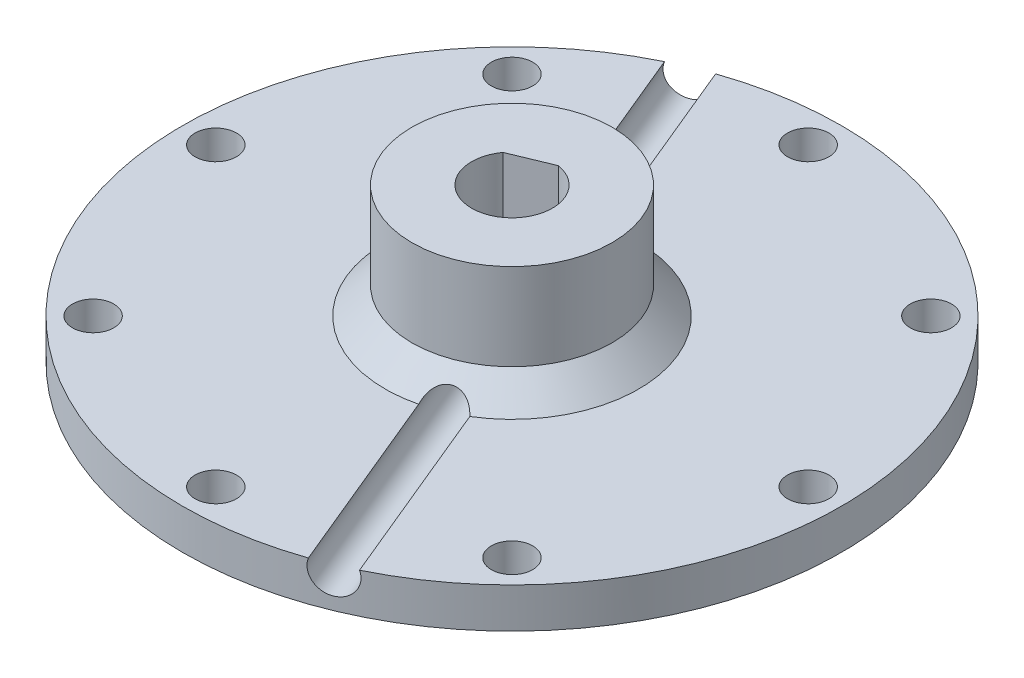
ISO-10303-21;
HEADER;
FILE_DESCRIPTION(('STEP AP214'),'2;1');
FILE_NAME('part.step','',(''),(''),'','','');
FILE_SCHEMA(('AUTOMOTIVE_DESIGN { 1 0 10303 214 1 1 1 1 }'));
ENDSEC;
DATA;
#1=APPLICATION_CONTEXT('core data for automotive mechanical design processes');
#2=APPLICATION_PROTOCOL_DEFINITION('international standard','automotive_design',2000,#1);
#3=PRODUCT_CONTEXT('',#1,'mechanical');
#4=PRODUCT('Part','Part','',(#3));
#5=PRODUCT_RELATED_PRODUCT_CATEGORY('part','',(#4));
#6=PRODUCT_DEFINITION_FORMATION('','',#4);
#7=PRODUCT_DEFINITION_CONTEXT('part definition',#1,'design');
#8=PRODUCT_DEFINITION('design','',#6,#7);
#9=PRODUCT_DEFINITION_SHAPE('','',#8);
#10=(LENGTH_UNIT() NAMED_UNIT(*) SI_UNIT(.MILLI.,.METRE.));
#11=(NAMED_UNIT(*) PLANE_ANGLE_UNIT() SI_UNIT($,.RADIAN.));
#12=(NAMED_UNIT(*) SI_UNIT($,.STERADIAN.) SOLID_ANGLE_UNIT());
#13=UNCERTAINTY_MEASURE_WITH_UNIT(LENGTH_MEASURE(1.E-05),#10,'distance_accuracy_value','');
#14=(GEOMETRIC_REPRESENTATION_CONTEXT(3) GLOBAL_UNCERTAINTY_ASSIGNED_CONTEXT((#13)) GLOBAL_UNIT_ASSIGNED_CONTEXT((#10,
#11,#12)) REPRESENTATION_CONTEXT('',''));
#15=CARTESIAN_POINT('',(0.,0.,0.));
#16=DIRECTION('',(0.,0.,1.));
#17=DIRECTION('',(1.,0.,0.));
#18=AXIS2_PLACEMENT_3D('',#15,#16,#17);
#19=CARTESIAN_POINT('',(0.,3.,0.));
#20=DIRECTION('',(0.,1.,0.));
#21=DIRECTION('',(0.,0.,1.));
#22=AXIS2_PLACEMENT_3D('',#19,#20,#21);
#23=PLANE('',#22);
#24=DIRECTION('',(0.38268343236509,0.,0.923879532511287));
#25=VECTOR('',#24,1.);
#26=CARTESIAN_POINT('',(-13.7035460192494,3.,-29.249464879421));
#27=LINE('',#26,#25);
#28=CARTESIAN_POINT('',(-10.7895840998216,3.,-22.2145384932994));
#29=VERTEX_POINT('',#28);
#30=CARTESIAN_POINT('',(-4.94733765736248,3.,-8.11010789718874));
#31=VERTEX_POINT('',#30);
#32=EDGE_CURVE('E69',#29,#31,#27,.T.);
#33=ORIENTED_EDGE('',*,*,#32,.F.);
#34=CARTESIAN_POINT('',(0.,3.,0.));
#35=DIRECTION('',(0.,1.,0.));
#36=DIRECTION('',(0.,0.,1.));
#37=AXIS2_PLACEMENT_3D('',#34,#35,#36);
#38=CIRCLE('',#37,24.6961706650526);
#39=CARTESIAN_POINT('',(8.07866272637523,3.,23.337438892708));
#40=VERTEX_POINT('',#39);
#41=EDGE_CURVE('E292',#29,#40,#38,.T.);
#42=ORIENTED_EDGE('',*,*,#41,.T.);
#43=CARTESIAN_POINT('',(2.23641628391495,2.99999999999957,9.23300829659804));
#44=VERTEX_POINT('',#43);
#45=EDGE_CURVE('E152',#44,#40,#27,.T.);
#46=ORIENTED_EDGE('',*,*,#45,.F.);
#47=CARTESIAN_POINT('',(0.,3.,0.));
#48=DIRECTION('',(0.,1.,0.));
#49=DIRECTION('',(0.,0.,1.));
#50=AXIS2_PLACEMENT_3D('',#47,#48,#49);
#51=CIRCLE('',#50,9.5);
#52=EDGE_CURVE('E115',#44,#31,#51,.F.);
#53=ORIENTED_EDGE('',*,*,#52,.T.);
#54=EDGE_LOOP('',(#33,#42,#46,#53));
#55=FACE_BOUND('',#54,.T.);
#56=CARTESIAN_POINT('',(-22.1961706650526,3.,0.));
#57=DIRECTION('',(0.,1.,0.));
#58=DIRECTION('',(0.,0.,1.));
#59=AXIS2_PLACEMENT_3D('',#56,#57,#58);
#60=CIRCLE('',#59,1.55);
#61=CARTESIAN_POINT('',(-22.1961706650526,3.,1.55));
#62=VERTEX_POINT('',#61);
#63=EDGE_CURVE('E289',#62,#62,#60,.T.);
#64=ORIENTED_EDGE('',*,*,#63,.F.);
#65=EDGE_LOOP('',(#64));
#66=FACE_BOUND('',#65,.T.);
#67=CARTESIAN_POINT('',(-15.6950627936326,3.,-15.6950627936326));
#68=DIRECTION('',(0.,1.,0.));
#69=DIRECTION('',(0.,0.,1.));
#70=AXIS2_PLACEMENT_3D('',#67,#68,#69);
#71=CIRCLE('',#70,1.55);
#72=CARTESIAN_POINT('',(-15.6950627936326,3.,-14.1450627936326));
#73=VERTEX_POINT('',#72);
#74=EDGE_CURVE('E286',#73,#73,#71,.T.);
#75=ORIENTED_EDGE('',*,*,#74,.F.);
#76=EDGE_LOOP('',(#75));
#77=FACE_BOUND('',#76,.T.);
#78=CARTESIAN_POINT('',(0.,3.,22.1961706650526));
#79=DIRECTION('',(0.,1.,0.));
#80=DIRECTION('',(0.,0.,1.));
#81=AXIS2_PLACEMENT_3D('',#78,#79,#80);
#82=CIRCLE('',#81,1.55);
#83=CARTESIAN_POINT('',(0.,3.,23.7461706650526));
#84=VERTEX_POINT('',#83);
#85=EDGE_CURVE('E271',#84,#84,#82,.T.);
#86=ORIENTED_EDGE('',*,*,#85,.F.);
#87=EDGE_LOOP('',(#86));
#88=FACE_BOUND('',#87,.T.);
#89=CARTESIAN_POINT('',(-15.6950627936326,3.,15.6950627936326));
#90=DIRECTION('',(0.,1.,0.));
#91=DIRECTION('',(0.,0.,1.));
#92=AXIS2_PLACEMENT_3D('',#89,#90,#91);
#93=CIRCLE('',#92,1.55);
#94=CARTESIAN_POINT('',(-15.6950627936326,3.,17.2450627936326));
#95=VERTEX_POINT('',#94);
#96=EDGE_CURVE('E269',#95,#95,#93,.T.);
#97=ORIENTED_EDGE('',*,*,#96,.F.);
#98=EDGE_LOOP('',(#97));
#99=FACE_BOUND('',#98,.T.);
#100=ADVANCED_FACE('F40',(#55,#66,#77,#88,#99),#23,.T.);
#101=CARTESIAN_POINT('',(-22.1961706650526,3.,0.));
#102=DIRECTION('',(0.,-1.,0.));
#103=DIRECTION('',(0.,0.,-1.));
#104=AXIS2_PLACEMENT_3D('',#101,#102,#103);
#105=CYLINDRICAL_SURFACE('',#104,1.55);
#106=ORIENTED_EDGE('',*,*,#63,.T.);
#107=EDGE_LOOP('',(#106));
#108=FACE_BOUND('',#107,.T.);
#109=CARTESIAN_POINT('',(-22.1961706650526,0.,0.));
#110=DIRECTION('',(0.,1.,0.));
#111=DIRECTION('',(0.,0.,1.));
#112=AXIS2_PLACEMENT_3D('',#109,#110,#111);
#113=CIRCLE('',#112,1.55);
#114=CARTESIAN_POINT('',(-22.1961706650526,0.,1.55));
#115=VERTEX_POINT('',#114);
#116=EDGE_CURVE('E244',#115,#115,#113,.T.);
#117=ORIENTED_EDGE('',*,*,#116,.F.);
#118=EDGE_LOOP('',(#117));
#119=FACE_BOUND('',#118,.T.);
#120=ADVANCED_FACE('F162',(#108,#119),#105,.F.);
#121=CARTESIAN_POINT('',(-15.6950627936326,3.,-15.6950627936326));
#122=DIRECTION('',(0.,-1.,0.));
#123=DIRECTION('',(0.,0.,-1.));
#124=AXIS2_PLACEMENT_3D('',#121,#122,#123);
#125=CYLINDRICAL_SURFACE('',#124,1.55);
#126=ORIENTED_EDGE('',*,*,#74,.T.);
#127=EDGE_LOOP('',(#126));
#128=FACE_BOUND('',#127,.T.);
#129=CARTESIAN_POINT('',(-15.6950627936326,0.,-15.6950627936326));
#130=DIRECTION('',(0.,1.,0.));
#131=DIRECTION('',(0.,0.,1.));
#132=AXIS2_PLACEMENT_3D('',#129,#130,#131);
#133=CIRCLE('',#132,1.55);
#134=CARTESIAN_POINT('',(-15.6950627936326,0.,-14.1450627936326));
#135=VERTEX_POINT('',#134);
#136=EDGE_CURVE('E240',#135,#135,#133,.T.);
#137=ORIENTED_EDGE('',*,*,#136,.F.);
#138=EDGE_LOOP('',(#137));
#139=FACE_BOUND('',#138,.T.);
#140=ADVANCED_FACE('F166',(#128,#139),#125,.F.);
#141=CARTESIAN_POINT('',(0.,3.,-22.1961706650526));
#142=DIRECTION('',(0.,-1.,0.));
#143=DIRECTION('',(0.,0.,-1.));
#144=AXIS2_PLACEMENT_3D('',#141,#142,#143);
#145=CYLINDRICAL_SURFACE('',#144,1.55);
#146=CARTESIAN_POINT('',(0.,3.,-22.1961706650526));
#147=DIRECTION('',(0.,1.,0.));
#148=DIRECTION('',(0.,0.,1.));
#149=AXIS2_PLACEMENT_3D('',#146,#147,#148);
#150=CIRCLE('',#149,1.55);
#151=CARTESIAN_POINT('',(0.,3.,-20.6461706650526));
#152=VERTEX_POINT('',#151);
#153=EDGE_CURVE('E283',#152,#152,#150,.T.);
#154=ORIENTED_EDGE('',*,*,#153,.T.);
#155=EDGE_LOOP('',(#154));
#156=FACE_BOUND('',#155,.T.);
#157=CARTESIAN_POINT('',(0.,0.,-22.1961706650526));
#158=DIRECTION('',(0.,1.,0.));
#159=DIRECTION('',(0.,0.,1.));
#160=AXIS2_PLACEMENT_3D('',#157,#158,#159);
#161=CIRCLE('',#160,1.55);
#162=CARTESIAN_POINT('',(0.,0.,-20.6461706650526));
#163=VERTEX_POINT('',#162);
#164=EDGE_CURVE('E236',#163,#163,#161,.T.);
#165=ORIENTED_EDGE('',*,*,#164,.F.);
#166=EDGE_LOOP('',(#165));
#167=FACE_BOUND('',#166,.T.);
#168=ADVANCED_FACE('F170',(#156,#167),#145,.F.);
#169=CARTESIAN_POINT('',(15.6950627936326,3.,-15.6950627936326));
#170=DIRECTION('',(0.,-1.,0.));
#171=DIRECTION('',(0.,0.,-1.));
#172=AXIS2_PLACEMENT_3D('',#169,#170,#171);
#173=CYLINDRICAL_SURFACE('',#172,1.55);
#174=CARTESIAN_POINT('',(15.6950627936326,3.,-15.6950627936326));
#175=DIRECTION('',(0.,1.,0.));
#176=DIRECTION('',(0.,0.,1.));
#177=AXIS2_PLACEMENT_3D('',#174,#175,#176);
#178=CIRCLE('',#177,1.55);
#179=CARTESIAN_POINT('',(15.6950627936326,3.,-14.1450627936326));
#180=VERTEX_POINT('',#179);
#181=EDGE_CURVE('E280',#180,#180,#178,.T.);
#182=ORIENTED_EDGE('',*,*,#181,.T.);
#183=EDGE_LOOP('',(#182));
#184=FACE_BOUND('',#183,.T.);
#185=CARTESIAN_POINT('',(15.6950627936326,0.,-15.6950627936326));
#186=DIRECTION('',(0.,1.,0.));
#187=DIRECTION('',(0.,0.,1.));
#188=AXIS2_PLACEMENT_3D('',#185,#186,#187);
#189=CIRCLE('',#188,1.55);
#190=CARTESIAN_POINT('',(15.6950627936326,0.,-14.1450627936326));
#191=VERTEX_POINT('',#190);
#192=EDGE_CURVE('E232',#191,#191,#189,.T.);
#193=ORIENTED_EDGE('',*,*,#192,.F.);
#194=EDGE_LOOP('',(#193));
#195=FACE_BOUND('',#194,.T.);
#196=ADVANCED_FACE('F174',(#184,#195),#173,.F.);
#197=CARTESIAN_POINT('',(22.1961706650526,3.,0.));
#198=DIRECTION('',(0.,-1.,0.));
#199=DIRECTION('',(0.,0.,-1.));
#200=AXIS2_PLACEMENT_3D('',#197,#198,#199);
#201=CYLINDRICAL_SURFACE('',#200,1.55);
#202=CARTESIAN_POINT('',(22.1961706650526,3.,0.));
#203=DIRECTION('',(0.,1.,0.));
#204=DIRECTION('',(0.,0.,1.));
#205=AXIS2_PLACEMENT_3D('',#202,#203,#204);
#206=CIRCLE('',#205,1.55);
#207=CARTESIAN_POINT('',(22.1961706650526,3.,1.55));
#208=VERTEX_POINT('',#207);
#209=EDGE_CURVE('E277',#208,#208,#206,.T.);
#210=ORIENTED_EDGE('',*,*,#209,.T.);
#211=EDGE_LOOP('',(#210));
#212=FACE_BOUND('',#211,.T.);
#213=CARTESIAN_POINT('',(22.1961706650526,0.,0.));
#214=DIRECTION('',(0.,1.,0.));
#215=DIRECTION('',(0.,0.,1.));
#216=AXIS2_PLACEMENT_3D('',#213,#214,#215);
#217=CIRCLE('',#216,1.55);
#218=CARTESIAN_POINT('',(22.1961706650526,0.,1.55));
#219=VERTEX_POINT('',#218);
#220=EDGE_CURVE('E228',#219,#219,#217,.T.);
#221=ORIENTED_EDGE('',*,*,#220,.F.);
#222=EDGE_LOOP('',(#221));
#223=FACE_BOUND('',#222,.T.);
#224=ADVANCED_FACE('F178',(#212,#223),#201,.F.);
#225=CARTESIAN_POINT('',(15.6950627936326,3.,15.6950627936326));
#226=DIRECTION('',(0.,-1.,0.));
#227=DIRECTION('',(0.,0.,-1.));
#228=AXIS2_PLACEMENT_3D('',#225,#226,#227);
#229=CYLINDRICAL_SURFACE('',#228,1.55);
#230=CARTESIAN_POINT('',(15.6950627936326,3.,15.6950627936326));
#231=DIRECTION('',(0.,1.,0.));
#232=DIRECTION('',(0.,0.,1.));
#233=AXIS2_PLACEMENT_3D('',#230,#231,#232);
#234=CIRCLE('',#233,1.55);
#235=CARTESIAN_POINT('',(15.6950627936326,3.,17.2450627936326));
#236=VERTEX_POINT('',#235);
#237=EDGE_CURVE('E274',#236,#236,#234,.T.);
#238=ORIENTED_EDGE('',*,*,#237,.T.);
#239=EDGE_LOOP('',(#238));
#240=FACE_BOUND('',#239,.T.);
#241=CARTESIAN_POINT('',(15.6950627936326,0.,15.6950627936326));
#242=DIRECTION('',(0.,1.,0.));
#243=DIRECTION('',(0.,0.,1.));
#244=AXIS2_PLACEMENT_3D('',#241,#242,#243);
#245=CIRCLE('',#244,1.55);
#246=CARTESIAN_POINT('',(15.6950627936326,0.,17.2450627936326));
#247=VERTEX_POINT('',#246);
#248=EDGE_CURVE('E224',#247,#247,#245,.T.);
#249=ORIENTED_EDGE('',*,*,#248,.F.);
#250=EDGE_LOOP('',(#249));
#251=FACE_BOUND('',#250,.T.);
#252=ADVANCED_FACE('F182',(#240,#251),#229,.F.);
#253=CARTESIAN_POINT('',(0.,3.,22.1961706650526));
#254=DIRECTION('',(0.,-1.,0.));
#255=DIRECTION('',(0.,0.,-1.));
#256=AXIS2_PLACEMENT_3D('',#253,#254,#255);
#257=CYLINDRICAL_SURFACE('',#256,1.55);
#258=ORIENTED_EDGE('',*,*,#85,.T.);
#259=EDGE_LOOP('',(#258));
#260=FACE_BOUND('',#259,.T.);
#261=CARTESIAN_POINT('',(0.,0.,22.1961706650526));
#262=DIRECTION('',(0.,1.,0.));
#263=DIRECTION('',(0.,0.,1.));
#264=AXIS2_PLACEMENT_3D('',#261,#262,#263);
#265=CIRCLE('',#264,1.55);
#266=CARTESIAN_POINT('',(0.,0.,23.7461706650526));
#267=VERTEX_POINT('',#266);
#268=EDGE_CURVE('E220',#267,#267,#265,.T.);
#269=ORIENTED_EDGE('',*,*,#268,.F.);
#270=EDGE_LOOP('',(#269));
#271=FACE_BOUND('',#270,.T.);
#272=ADVANCED_FACE('F186',(#260,#271),#257,.F.);
#273=CARTESIAN_POINT('',(-15.6950627936326,3.,15.6950627936326));
#274=DIRECTION('',(0.,-1.,0.));
#275=DIRECTION('',(0.,0.,-1.));
#276=AXIS2_PLACEMENT_3D('',#273,#274,#275);
#277=CYLINDRICAL_SURFACE('',#276,1.55);
#278=ORIENTED_EDGE('',*,*,#96,.T.);
#279=EDGE_LOOP('',(#278));
#280=FACE_BOUND('',#279,.T.);
#281=CARTESIAN_POINT('',(-15.6950627936326,0.,15.6950627936326));
#282=DIRECTION('',(0.,1.,0.));
#283=DIRECTION('',(0.,0.,1.));
#284=AXIS2_PLACEMENT_3D('',#281,#282,#283);
#285=CIRCLE('',#284,1.55);
#286=CARTESIAN_POINT('',(-15.6950627936326,0.,17.2450627936326));
#287=VERTEX_POINT('',#286);
#288=EDGE_CURVE('E216',#287,#287,#285,.T.);
#289=ORIENTED_EDGE('',*,*,#288,.F.);
#290=EDGE_LOOP('',(#289));
#291=FACE_BOUND('',#290,.T.);
#292=ADVANCED_FACE('F158',(#280,#291),#277,.F.);
#293=CARTESIAN_POINT('',(0.,3.,0.));
#294=DIRECTION('',(0.,-1.,0.));
#295=DIRECTION('',(0.,0.,-1.));
#296=AXIS2_PLACEMENT_3D('',#293,#294,#295);
#297=CYLINDRICAL_SURFACE('',#296,24.6961706650526);
#298=CARTESIAN_POINT('',(10.7895840998216,3.,22.2145384932994));
#299=VERTEX_POINT('',#298);
#300=CARTESIAN_POINT('',(-8.07866272637523,3.,-23.337438892708));
#301=VERTEX_POINT('',#300);
#302=EDGE_CURVE('E112',#299,#301,#38,.T.);
#303=ORIENTED_EDGE('',*,*,#302,.F.);
#304=CARTESIAN_POINT('',(10.7895840998216,3.,22.2145384932994));
#305=CARTESIAN_POINT('',(10.8022360928086,2.95879962781761,22.2083928428077));
#306=CARTESIAN_POINT('',(10.8133140382241,2.9170255524788,22.2029996113005));
#307=CARTESIAN_POINT('',(10.8322640657164,2.83259057458305,22.1937607504593));
#308=CARTESIAN_POINT('',(10.8401362861034,2.7899297103699,22.1899150543575));
#309=CARTESIAN_POINT('',(10.8588388864953,2.66114189934561,22.1807726157804));
#310=CARTESIAN_POINT('',(10.8647966432603,2.57407426730937,22.177850299482));
#311=CARTESIAN_POINT('',(10.8634984916603,2.40006320132649,22.1784860302414));
#312=CARTESIAN_POINT('',(10.856236153074,2.31311984841532,22.1820472308658));
#313=CARTESIAN_POINT('',(10.8286930993518,2.14183088982806,22.1955059414178));
#314=CARTESIAN_POINT('',(10.8084149380635,2.05748477794634,22.2054022083349));
#315=CARTESIAN_POINT('',(10.7553727091612,1.89376877390713,22.2311418109063));
#316=CARTESIAN_POINT('',(10.7226075821615,1.81439930463019,22.2469856511472));
#317=CARTESIAN_POINT('',(10.6454506229444,1.66286769418197,22.2840088427002));
#318=CARTESIAN_POINT('',(10.6010568581839,1.59070675373967,22.3051890808367));
#319=CARTESIAN_POINT('',(10.5017340006025,1.45552656179287,22.3521238703291));
#320=CARTESIAN_POINT('',(10.4467874488021,1.39252276803391,22.3778859968588));
#321=CARTESIAN_POINT('',(10.3278741180891,1.27758387700326,22.4330146731566));
#322=CARTESIAN_POINT('',(10.2639078700666,1.22564812872919,22.4623810107713));
#323=CARTESIAN_POINT('',(10.1286189431594,1.13427573766546,22.5237083083923));
#324=CARTESIAN_POINT('',(10.057290439116,1.09484909436228,22.5556713186127));
#325=CARTESIAN_POINT('',(9.90926799710084,1.02967692543697,22.6210918045258));
#326=CARTESIAN_POINT('',(9.83257399388917,1.00393156620036,22.6545492983885));
#327=CARTESIAN_POINT('',(9.67606085720705,0.966887981824472,22.7218382654112));
#328=CARTESIAN_POINT('',(9.59624616541288,0.955569942177125,22.7556691611468));
#329=CARTESIAN_POINT('',(9.43564166056505,0.947641643328105,22.8227317306031));
#330=CARTESIAN_POINT('',(9.35485186378584,0.951031138996082,22.8559634143017));
#331=CARTESIAN_POINT('',(9.19471384650946,0.972404857861036,22.9208537974291));
#332=CARTESIAN_POINT('',(9.1153637992393,0.990369038646257,22.9525145936618));
#333=CARTESIAN_POINT('',(8.9602752418756,1.04035192806661,23.0135017154118));
#334=CARTESIAN_POINT('',(8.8845367631239,1.07237075864591,23.0428280206714));
#335=CARTESIAN_POINT('',(8.73881687301453,1.14957984680581,23.0984852322));
#336=CARTESIAN_POINT('',(8.66883984497706,1.19478001617149,23.1248138635593));
#337=CARTESIAN_POINT('',(8.53675771208966,1.29706140064328,23.1738988051234));
#338=CARTESIAN_POINT('',(8.47465273500001,1.35414280853749,23.1966550573514));
#339=CARTESIAN_POINT('',(8.36005331339816,1.47868445638766,23.2382031245833));
#340=CARTESIAN_POINT('',(8.30757578764602,1.54616259139837,23.2569879691112));
#341=CARTESIAN_POINT('',(8.21394309931337,1.68951370987362,23.2902224279577));
#342=CARTESIAN_POINT('',(8.17278725043664,1.76538618409989,23.3046723050576));
#343=CARTESIAN_POINT('',(8.10304780692007,1.92336894897091,23.3290126796536));
#344=CARTESIAN_POINT('',(8.07446234942336,2.00547831322938,23.3389038527327));
#345=CARTESIAN_POINT('',(8.03072635730518,2.17364910770879,23.3539893837585));
#346=CARTESIAN_POINT('',(8.01558048696062,2.25971189909631,23.359182111098));
#347=CARTESIAN_POINT('',(7.99921207685348,2.43319576767113,23.3647924758908));
#348=CARTESIAN_POINT('',(7.99797482047534,2.52061531115866,23.3652151604977));
#349=CARTESIAN_POINT('',(8.00943754926358,2.69434563507746,23.3612883614247));
#350=CARTESIAN_POINT('',(8.02211404236827,2.78065803623228,23.3569469215251));
#351=CARTESIAN_POINT('',(8.04673153782703,2.88790204757831,23.3484685370391));
#352=CARTESIAN_POINT('',(8.05245053209231,2.91055342740217,23.3464971112647));
#353=CARTESIAN_POINT('',(8.0648434113593,2.95552370214161,23.3422190630859));
#354=CARTESIAN_POINT('',(8.07151581685066,2.9778430541249,23.339912959951));
#355=CARTESIAN_POINT('',(8.07866272637523,3.,23.337438892708));
#356=B_SPLINE_CURVE_WITH_KNOTS('',3,(#304,#305,#306,#307,#308,#309,#310,#311,#312,#313,#314,
#315,#316,#317,#318,#319,#320,#321,#322,#323,#324,#325,#326,#327,#328,#329,#330,#331,#332,#333,
#334,#335,#336,#337,#338,#339,#340,#341,#342,#343,#344,#345,#346,#347,#348,#349,#350,#351,#352,
#353,#354,#355),.UNSPECIFIED.,.F.,.F.,(4,2,2,2,2,2,2,2,2,2,2,2,2,2,2,2,2,2,2,2,2,2,2,2,2,4),(0.,
0.130525574978584,0.261045517865425,0.521661569811764,0.782404418630193,1.04309612247034,
1.30380994814602,1.56456712891937,1.82575949280557,2.08693648958715,2.34832174219255,
2.60971017357332,2.87073922543377,3.13176392674224,3.39243028651257,3.65309890798057,
3.91396404840913,4.17483342203377,4.43615693147836,4.69746459654972,4.95873352432607,
5.22009309138493,5.48117608949417,5.74181895058583,5.81213954096621,5.88235216915003),.UNSPECIFIED.);
#357=EDGE_CURVE('E144',#299,#40,#356,.T.);
#358=ORIENTED_EDGE('',*,*,#357,.T.);
#359=ORIENTED_EDGE('',*,*,#41,.F.);
#360=CARTESIAN_POINT('',(-10.7895840998216,3.,-22.2145384932994));
#361=CARTESIAN_POINT('',(-10.8022360928086,2.95879962781761,-22.2083928428077));
#362=CARTESIAN_POINT('',(-10.8133140382241,2.9170255524788,-22.2029996113005));
#363=CARTESIAN_POINT('',(-10.8322640657164,2.83259057458306,-22.1937607504593));
#364=CARTESIAN_POINT('',(-10.8401362861034,2.78992971036991,-22.1899150543575));
#365=CARTESIAN_POINT('',(-10.8588388864953,2.66114189934561,-22.1807726157804));
#366=CARTESIAN_POINT('',(-10.8647966432603,2.57407426730937,-22.177850299482));
#367=CARTESIAN_POINT('',(-10.8634984916604,2.40006320132649,-22.1784860302414));
#368=CARTESIAN_POINT('',(-10.856236153074,2.31311984841532,-22.1820472308658));
#369=CARTESIAN_POINT('',(-10.8286930993518,2.14183088982806,-22.1955059414178));
#370=CARTESIAN_POINT('',(-10.8084149380635,2.05748477794634,-22.2054022083349));
#371=CARTESIAN_POINT('',(-10.7553727091612,1.89376877390713,-22.2311418109063));
#372=CARTESIAN_POINT('',(-10.7226075821615,1.81439930463019,-22.2469856511472));
#373=CARTESIAN_POINT('',(-10.6454506229444,1.66286769418198,-22.2840088427002));
#374=CARTESIAN_POINT('',(-10.6010568581839,1.59070675373967,-22.3051890808367));
#375=CARTESIAN_POINT('',(-10.5017340006025,1.45552656179288,-22.3521238703291));
#376=CARTESIAN_POINT('',(-10.4467874488021,1.39252276803391,-22.3778859968588));
#377=CARTESIAN_POINT('',(-10.3278741180891,1.27758387700327,-22.4330146731566));
#378=CARTESIAN_POINT('',(-10.2639078700666,1.22564812872919,-22.4623810107713));
#379=CARTESIAN_POINT('',(-10.1286189431594,1.13427573766546,-22.5237083083923));
#380=CARTESIAN_POINT('',(-10.057290439116,1.09484909436228,-22.5556713186127));
#381=CARTESIAN_POINT('',(-9.90926799710085,1.02967692543697,-22.6210918045258));
#382=CARTESIAN_POINT('',(-9.83257399388917,1.00393156620036,-22.6545492983885));
#383=CARTESIAN_POINT('',(-9.67606085720705,0.966887981824473,-22.7218382654112));
#384=CARTESIAN_POINT('',(-9.59624616541288,0.955569942177125,-22.7556691611468));
#385=CARTESIAN_POINT('',(-9.43564166056505,0.947641643328105,-22.8227317306031));
#386=CARTESIAN_POINT('',(-9.35485186378584,0.951031138996082,-22.8559634143017));
#387=CARTESIAN_POINT('',(-9.19471384650947,0.972404857861035,-22.9208537974291));
#388=CARTESIAN_POINT('',(-9.1153637992393,0.990369038646256,-22.9525145936618));
#389=CARTESIAN_POINT('',(-8.9602752418756,1.04035192806661,-23.0135017154118));
#390=CARTESIAN_POINT('',(-8.88453676312391,1.07237075864591,-23.0428280206714));
#391=CARTESIAN_POINT('',(-8.73881687301454,1.14957984680581,-23.0984852322));
#392=CARTESIAN_POINT('',(-8.66883984497707,1.19478001617149,-23.1248138635593));
#393=CARTESIAN_POINT('',(-8.53675771208967,1.29706140064328,-23.1738988051234));
#394=CARTESIAN_POINT('',(-8.47465273500001,1.35414280853748,-23.1966550573514));
#395=CARTESIAN_POINT('',(-8.36005331339816,1.47868445638766,-23.2382031245833));
#396=CARTESIAN_POINT('',(-8.30757578764603,1.54616259139836,-23.2569879691112));
#397=CARTESIAN_POINT('',(-8.21394309931337,1.68951370987362,-23.2902224279577));
#398=CARTESIAN_POINT('',(-8.17278725043665,1.76538618409988,-23.3046723050576));
#399=CARTESIAN_POINT('',(-8.10304780692008,1.92336894897091,-23.3290126796536));
#400=CARTESIAN_POINT('',(-8.07446234942336,2.00547831322937,-23.3389038527327));
#401=CARTESIAN_POINT('',(-8.03072635730518,2.17364910770878,-23.3539893837585));
#402=CARTESIAN_POINT('',(-8.01558048696062,2.2597118990963,-23.359182111098));
#403=CARTESIAN_POINT('',(-7.99921207685348,2.43319576767112,-23.3647924758908));
#404=CARTESIAN_POINT('',(-7.99797482047534,2.52061531115865,-23.3652151604977));
#405=CARTESIAN_POINT('',(-8.00943754926358,2.69434563507745,-23.3612883614247));
#406=CARTESIAN_POINT('',(-8.02211404236827,2.78065803623228,-23.3569469215251));
#407=CARTESIAN_POINT('',(-8.04673153782703,2.88790204757831,-23.3484685370391));
#408=CARTESIAN_POINT('',(-8.05245053209231,2.91055342740217,-23.3464971112647));
#409=CARTESIAN_POINT('',(-8.0648434113593,2.95552370214161,-23.3422190630859));
#410=CARTESIAN_POINT('',(-8.07151581685066,2.9778430541249,-23.339912959951));
#411=CARTESIAN_POINT('',(-8.07866272637523,3.,-23.337438892708));
#412=B_SPLINE_CURVE_WITH_KNOTS('',3,(#360,#361,#362,#363,#364,#365,#366,#367,#368,#369,#370,
#371,#372,#373,#374,#375,#376,#377,#378,#379,#380,#381,#382,#383,#384,#385,#386,#387,#388,#389,
#390,#391,#392,#393,#394,#395,#396,#397,#398,#399,#400,#401,#402,#403,#404,#405,#406,#407,#408,
#409,#410,#411),.UNSPECIFIED.,.F.,.F.,(4,2,2,2,2,2,2,2,2,2,2,2,2,2,2,2,2,2,2,2,2,2,2,2,2,4),(0.,
0.130525574978583,0.261045517865424,0.52166156981176,0.782404418630188,1.04309612247034,
1.30380994814602,1.56456712891936,1.82575949280556,2.08693648958714,2.34832174219254,
2.60971017357331,2.87073922543377,3.13176392674224,3.39243028651256,3.65309890798057,
3.91396404840912,4.17483342203376,4.43615693147835,4.69746459654972,4.95873352432606,
5.22009309138492,5.48117608949417,5.74181895058583,5.81213954096621,5.88235216915003),.UNSPECIFIED.);
#413=EDGE_CURVE('E136',#29,#301,#412,.T.);
#414=ORIENTED_EDGE('',*,*,#413,.T.);
#415=EDGE_LOOP('',(#303,#358,#359,#414));
#416=FACE_BOUND('',#415,.T.);
#417=CARTESIAN_POINT('',(0.,0.,0.));
#418=DIRECTION('',(0.,1.,0.));
#419=DIRECTION('',(0.,0.,1.));
#420=AXIS2_PLACEMENT_3D('',#417,#418,#419);
#421=CIRCLE('',#420,24.6961706650526);
#422=CARTESIAN_POINT('',(0.,0.,24.6961706650526));
#423=VERTEX_POINT('',#422);
#424=EDGE_CURVE('E248',#423,#423,#421,.T.);
#425=ORIENTED_EDGE('',*,*,#424,.T.);
#426=EDGE_LOOP('',(#425));
#427=FACE_BOUND('',#426,.T.);
#428=ADVANCED_FACE('F153',(#416,#427),#297,.T.);
#429=DIRECTION('',(0.38268343236509,0.,0.923879532511287));
#430=VECTOR('',#429,1.);
#431=CARTESIAN_POINT('',(-10.9926246458031,3.,-30.3723652788295));
#432=LINE('',#431,#430);
#433=CARTESIAN_POINT('',(4.94733765736248,3.,8.11010789718874));
#434=VERTEX_POINT('',#433);
#435=EDGE_CURVE('E62',#299,#434,#432,.F.);
#436=ORIENTED_EDGE('',*,*,#435,.F.);
#437=ORIENTED_EDGE('',*,*,#302,.T.);
#438=CARTESIAN_POINT('',(-2.23641628391495,2.99999999999957,-9.23300829659804));
#439=VERTEX_POINT('',#438);
#440=EDGE_CURVE('E99',#439,#301,#432,.F.);
#441=ORIENTED_EDGE('',*,*,#440,.F.);
#442=EDGE_CURVE('E105',#439,#434,#51,.F.);
#443=ORIENTED_EDGE('',*,*,#442,.T.);
#444=EDGE_LOOP('',(#436,#437,#441,#443));
#445=FACE_BOUND('',#444,.T.);
#446=ORIENTED_EDGE('',*,*,#237,.F.);
#447=EDGE_LOOP('',(#446));
#448=FACE_BOUND('',#447,.T.);
#449=ORIENTED_EDGE('',*,*,#209,.F.);
#450=EDGE_LOOP('',(#449));
#451=FACE_BOUND('',#450,.T.);
#452=ORIENTED_EDGE('',*,*,#181,.F.);
#453=EDGE_LOOP('',(#452));
#454=FACE_BOUND('',#453,.T.);
#455=ORIENTED_EDGE('',*,*,#153,.F.);
#456=EDGE_LOOP('',(#455));
#457=FACE_BOUND('',#456,.T.);
#458=ADVANCED_FACE('F109',(#445,#448,#451,#454,#457),#23,.T.);
#459=CARTESIAN_POINT('',(0.,0.,0.));
#460=DIRECTION('',(0.,1.,0.));
#461=DIRECTION('',(0.,0.,1.));
#462=AXIS2_PLACEMENT_3D('',#459,#460,#461);
#463=PLANE('',#462);
#464=ORIENTED_EDGE('',*,*,#288,.T.);
#465=EDGE_LOOP('',(#464));
#466=FACE_BOUND('',#465,.T.);
#467=ORIENTED_EDGE('',*,*,#268,.T.);
#468=EDGE_LOOP('',(#467));
#469=FACE_BOUND('',#468,.T.);
#470=ORIENTED_EDGE('',*,*,#248,.T.);
#471=EDGE_LOOP('',(#470));
#472=FACE_BOUND('',#471,.T.);
#473=ORIENTED_EDGE('',*,*,#220,.T.);
#474=EDGE_LOOP('',(#473));
#475=FACE_BOUND('',#474,.T.);
#476=ORIENTED_EDGE('',*,*,#192,.T.);
#477=EDGE_LOOP('',(#476));
#478=FACE_BOUND('',#477,.T.);
#479=ORIENTED_EDGE('',*,*,#164,.T.);
#480=EDGE_LOOP('',(#479));
#481=FACE_BOUND('',#480,.T.);
#482=ORIENTED_EDGE('',*,*,#136,.T.);
#483=EDGE_LOOP('',(#482));
#484=FACE_BOUND('',#483,.T.);
#485=ORIENTED_EDGE('',*,*,#116,.T.);
#486=EDGE_LOOP('',(#485));
#487=FACE_BOUND('',#486,.T.);
#488=ORIENTED_EDGE('',*,*,#424,.F.);
#489=EDGE_LOOP('',(#488));
#490=FACE_BOUND('',#489,.T.);
#491=CARTESIAN_POINT('',(0.,0.,0.));
#492=DIRECTION('',(0.,1.,0.));
#493=DIRECTION('',(0.,0.,1.));
#494=AXIS2_PLACEMENT_3D('',#491,#492,#493);
#495=CIRCLE('',#494,3.025);
#496=CARTESIAN_POINT('',(-2.45202312898459,0.,-1.77149868047498));
#497=VERTEX_POINT('',#496);
#498=CARTESIAN_POINT('',(0.481203452304365,0.,-2.98648091195814));
#499=VERTEX_POINT('',#498);
#500=EDGE_CURVE('E252',#497,#499,#495,.T.);
#501=ORIENTED_EDGE('',*,*,#500,.T.);
#502=DIRECTION('',(0.923879532511287,0.,-0.38268343236509));
#503=VECTOR('',#502,1.);
#504=CARTESIAN_POINT('',(-0.985409838340105,0.,-2.37898979621656));
#505=LINE('',#504,#503);
#506=EDGE_CURVE('E254',#497,#499,#505,.T.);
#507=ORIENTED_EDGE('',*,*,#506,.F.);
#508=EDGE_LOOP('',(#501,#507));
#509=FACE_BOUND('',#508,.T.);
#510=ADVANCED_FACE('F160',(#466,#469,#472,#475,#478,#481,#484,#487,#490,#509),#463,.F.);
#511=CARTESIAN_POINT('',(0.,11.5,0.));
#512=DIRECTION('',(0.,-1.,0.));
#513=DIRECTION('',(0.,0.,-1.));
#514=AXIS2_PLACEMENT_3D('',#511,#512,#513);
#515=CYLINDRICAL_SURFACE('',#514,3.025);
#516=CARTESIAN_POINT('',(2.42611589891925,2.5,1.80681671594307));
#517=CARTESIAN_POINT('',(2.42611335969098,2.41954877668076,1.80682591563397));
#518=CARTESIAN_POINT('',(2.42174223432623,2.33900315854965,1.81273576978432));
#519=CARTESIAN_POINT('',(2.40435168186248,2.18040971369051,1.83573205341519));
#520=CARTESIAN_POINT('',(2.39131499047382,2.10236719988277,1.85284079324418));
#521=CARTESIAN_POINT('',(2.35693645354836,1.9513768327537,1.89637356902245));
#522=CARTESIAN_POINT('',(2.33564049627968,1.87840341210594,1.92274606077229));
#523=CARTESIAN_POINT('',(2.28498255467964,1.73850609549052,1.98267871027372));
#524=CARTESIAN_POINT('',(2.2556197960782,1.67158278104584,2.01623955791202));
#525=CARTESIAN_POINT('',(2.18606742374154,1.53927179770308,2.0915496367093));
#526=CARTESIAN_POINT('',(2.14515889309192,1.474522493648,2.13375691734257));
#527=CARTESIAN_POINT('',(2.05407702625416,1.35449025415653,2.2215751821185));
#528=CARTESIAN_POINT('',(2.00389889346798,1.29921224836196,2.26718792111669));
#529=CARTESIAN_POINT('',(1.89055491281362,1.1958081781109,2.36268838717468));
#530=CARTESIAN_POINT('',(1.82671597862932,1.14847863684465,2.4126482082651));
#531=CARTESIAN_POINT('',(1.6894134214709,1.06792287397047,2.51069761220414));
#532=CARTESIAN_POINT('',(1.61595621442744,1.03468731297695,2.55878841430482));
#533=CARTESIAN_POINT('',(1.46682339325955,0.985828932648054,2.6468829319053));
#534=CARTESIAN_POINT('',(1.39171557717191,0.969083427178568,2.68722184852151));
#535=CARTESIAN_POINT('',(1.23685697641882,0.949971752980353,2.76191628079421));
#536=CARTESIAN_POINT('',(1.15710919779662,0.947596376885469,2.79627561403471));
#537=CARTESIAN_POINT('',(1.00312911067712,0.956885479738964,2.85491269532514));
#538=CARTESIAN_POINT('',(0.929057242409425,0.967289049344221,2.87982416717148));
#539=CARTESIAN_POINT('',(0.781568287990435,0.999568261486031,2.92330087847112));
#540=CARTESIAN_POINT('',(0.708151251490788,1.02144476654564,2.9418656406122));
#541=CARTESIAN_POINT('',(0.563078699820142,1.07616049940242,2.97307100536979));
#542=CARTESIAN_POINT('',(0.491459386649373,1.10914106572549,2.98562990108788));
#543=CARTESIAN_POINT('',(0.352813228794187,1.18491752565744,3.00517169437008));
#544=CARTESIAN_POINT('',(0.28578800767399,1.22771686625516,3.01215262986243));
#545=CARTESIAN_POINT('',(0.151615552044704,1.32672203549003,3.02201818152414));
#546=CARTESIAN_POINT('',(0.0850994473980979,1.38383041471826,3.0244345751437));
#547=CARTESIAN_POINT('',(-0.0386720986651586,1.50743205176079,3.02538728354007));
#548=CARTESIAN_POINT('',(-0.0959197895490483,1.57393307788253,3.02392036857738));
#549=CARTESIAN_POINT('',(-0.202740962632213,1.72003786883287,3.01870445390612));
#550=CARTESIAN_POINT('',(-0.25151017791939,1.80022966171224,3.01480468204696));
#551=CARTESIAN_POINT('',(-0.333493320403339,1.96819408797235,3.00684549619263));
#552=CARTESIAN_POINT('',(-0.366724088504396,2.05595839128204,3.00278626022672));
#553=CARTESIAN_POINT('',(-0.413189514262967,2.22919416262904,2.9967334856893));
#554=CARTESIAN_POINT('',(-0.427815609480395,2.31428381318527,2.99460024353686));
#555=CARTESIAN_POINT('',(-0.440564575261205,2.48569218929386,2.99275441769474));
#556=CARTESIAN_POINT('',(-0.438700533293264,2.57200988588584,2.99303991435494));
#557=CARTESIAN_POINT('',(-0.419867685043623,2.73257174561473,2.99573011688823));
#558=CARTESIAN_POINT('',(-0.4047022102714,2.80704135052952,2.99788148211388));
#559=CARTESIAN_POINT('',(-0.362672898015103,2.95255360296987,3.00325469737486));
#560=CARTESIAN_POINT('',(-0.335805014187873,3.02359505569667,3.00647691758842));
#561=CARTESIAN_POINT('',(-0.270256322570867,3.16395957977124,3.0130904458659));
#562=CARTESIAN_POINT('',(-0.231090152556572,3.2330543229061,3.01648272978165));
#563=CARTESIAN_POINT('',(-0.143053389237048,3.36481418964628,3.02193731270739));
#564=CARTESIAN_POINT('',(-0.0941777978127882,3.42747597645472,3.023998924395));
#565=CARTESIAN_POINT('',(0.0188885901865116,3.55336082041319,3.0255366191547));
#566=CARTESIAN_POINT('',(0.0842533291681622,3.61553890920874,3.02463018610618));
#567=CARTESIAN_POINT('',(0.223521812025064,3.72917064825512,3.0175361859016));
#568=CARTESIAN_POINT('',(0.297428895816652,3.78062008158178,3.01134654701878));
#569=CARTESIAN_POINT('',(0.454074883410826,3.87275170816148,2.99179825501848));
#570=CARTESIAN_POINT('',(0.537019097093992,3.9130421969544,2.97821920100737));
#571=CARTESIAN_POINT('',(0.706826869104419,3.97887400741653,2.9425364315885));
#572=CARTESIAN_POINT('',(0.793686740128718,4.0044289049462,2.92044059409122));
#573=CARTESIAN_POINT('',(0.959708988095148,4.03776183938971,2.86991138691474));
#574=CARTESIAN_POINT('',(1.03882258080197,4.0469923452584,2.84227485857842));
#575=CARTESIAN_POINT('',(1.1947961403514,4.05175624070664,2.78030883725933));
#576=CARTESIAN_POINT('',(1.27165696886393,4.04729493821437,2.74598194277494));
#577=CARTESIAN_POINT('',(1.41531890152986,4.02573428841801,2.67459862880595));
#578=CARTESIAN_POINT('',(1.48244646940406,4.00955956382106,2.63791182023711));
#579=CARTESIAN_POINT('',(1.61112417563626,3.96631926239284,2.56134972976354));
#580=CARTESIAN_POINT('',(1.67267354955375,3.93925219562231,2.52147401225323));
#581=CARTESIAN_POINT('',(1.79159472859978,3.87385852208841,2.43850120560746));
#582=CARTESIAN_POINT('',(1.8486900316641,3.8351140550023,2.39533908197524));
#583=CARTESIAN_POINT('',(1.95517371791695,3.7479833464837,2.30924597760345));
#584=CARTESIAN_POINT('',(2.00455859138012,3.69959273689051,2.26631511066487));
#585=CARTESIAN_POINT('',(2.10008008486776,3.58873899717953,2.17828633445753));
#586=CARTESIAN_POINT('',(2.1453481930529,3.52533674540387,2.13342566696064));
#587=CARTESIAN_POINT('',(2.22607016315682,3.38926279729588,2.04906181895448));
#588=CARTESIAN_POINT('',(2.26151457968987,3.3165822773679,2.00956381307466));
#589=CARTESIAN_POINT('',(2.32357609890138,3.16029840337218,1.93751702897676));
#590=CARTESIAN_POINT('',(2.34978970653947,3.07637721385238,1.90530395113836));
#591=CARTESIAN_POINT('',(2.39094448515739,2.90227426944397,1.85341113932439));
#592=CARTESIAN_POINT('',(2.40592317734874,2.81211446167861,1.83368972162661));
#593=CARTESIAN_POINT('',(2.41878544765035,2.68407817341475,1.8166256493584));
#594=CARTESIAN_POINT('',(2.42153162226871,2.64742073269914,1.81295857125678));
#595=CARTESIAN_POINT('',(2.42519749062123,2.57384883744826,1.80805191326021));
#596=CARTESIAN_POINT('',(2.426117064654,2.53693436622824,1.80681249245536));
#597=CARTESIAN_POINT('',(2.42611589891925,2.5,1.80681671594307));
#598=B_SPLINE_CURVE_WITH_KNOTS('',3,(#516,#517,#518,#519,#520,#521,#522,#523,#524,#525,#526,
#527,#528,#529,#530,#531,#532,#533,#534,#535,#536,#537,#538,#539,#540,#541,#542,#543,#544,#545,
#546,#547,#548,#549,#550,#551,#552,#553,#554,#555,#556,#557,#558,#559,#560,#561,#562,#563,#564,
#565,#566,#567,#568,#569,#570,#571,#572,#573,#574,#575,#576,#577,#578,#579,#580,#581,#582,#583,
#584,#585,#586,#587,#588,#589,#590,#591,#592,#593,#594,#595,#596,#597),.UNSPECIFIED.,.T.,.F.,(4,
2,2,2,2,2,2,2,2,2,2,2,2,2,2,2,2,2,2,2,2,2,2,2,2,2,2,2,2,2,2,2,2,2,2,2,2,2,2,2,4),(0.,
0.24119803969301,0.482878061043634,0.723234118546388,0.963613254039653,1.22487290915804,
1.48626813489677,1.76639761131735,2.04634116857977,2.30553931672435,2.56457137135833,
2.79997529335275,3.03539691530047,3.27393613114082,3.51255921729428,3.77455593973962,
4.03677063274789,4.31711499629018,4.59715480823461,4.85470694808801,5.11205469892157,
5.33911795673492,5.5662597886388,5.80382146581764,6.04150575099799,6.31096677425809,
6.58053351102395,6.85862017816281,7.13645023376989,7.38800888272922,7.63947002181133,
7.87298587557807,8.10653368232241,8.3497013824994,8.59297944995619,8.86149624111446,
9.13027031996825,9.40964973917606,9.68809190973148,9.79881630430286,9.90954795466206),.UNSPECIFIED.);
#599=CARTESIAN_POINT('',(2.42611589891925,2.5,1.80681671594307));
#600=VERTEX_POINT('',#599);
#601=EDGE_CURVE('E256',#600,#600,#598,.T.);
#602=ORIENTED_EDGE('',*,*,#601,.F.);
#603=EDGE_LOOP('',(#602));
#604=FACE_BOUND('',#603,.T.);
#605=ORIENTED_EDGE('',*,*,#500,.F.);
#606=DIRECTION('',(0.,-1.,0.));
#607=VECTOR('',#606,1.);
#608=CARTESIAN_POINT('',(-2.45202312898459,11.5,-1.77149868047498));
#609=LINE('',#608,#607);
#610=CARTESIAN_POINT('',(-2.45202312898459,11.5,-1.77149868047498));
#611=VERTEX_POINT('',#610);
#612=EDGE_CURVE('E267',#611,#497,#609,.T.);
#613=ORIENTED_EDGE('',*,*,#612,.F.);
#614=CARTESIAN_POINT('',(0.,11.5,0.));
#615=DIRECTION('',(0.,1.,0.));
#616=DIRECTION('',(0.,0.,1.));
#617=AXIS2_PLACEMENT_3D('',#614,#615,#616);
#618=CIRCLE('',#617,3.025);
#619=CARTESIAN_POINT('',(0.481203452304365,11.5,-2.98648091195814));
#620=VERTEX_POINT('',#619);
#621=EDGE_CURVE('E258',#611,#620,#618,.T.);
#622=ORIENTED_EDGE('',*,*,#621,.T.);
#623=DIRECTION('',(0.,-1.,0.));
#624=VECTOR('',#623,1.);
#625=CARTESIAN_POINT('',(0.481203452304365,11.5,-2.98648091195814));
#626=LINE('',#625,#624);
#627=EDGE_CURVE('E265',#620,#499,#626,.T.);
#628=ORIENTED_EDGE('',*,*,#627,.T.);
#629=EDGE_LOOP('',(#605,#613,#622,#628));
#630=FACE_BOUND('',#629,.T.);
#631=ADVANCED_FACE('F206',(#604,#630),#515,.F.);
#632=CARTESIAN_POINT('',(-0.985409838340105,11.5,-2.37898979621656));
#633=DIRECTION('',(-0.38268343236509,0.,-0.923879532511287));
#634=DIRECTION('',(-0.923879532511287,0.,0.38268343236509));
#635=AXIS2_PLACEMENT_3D('',#632,#633,#634);
#636=PLANE('',#635);
#637=CARTESIAN_POINT('',(-0.985409838340107,2.5,-2.37898979621656));
#638=DIRECTION('',(-0.38268343236509,0.,-0.923879532511287));
#639=DIRECTION('',(-0.923879532511287,0.,0.38268343236509));
#640=AXIS2_PLACEMENT_3D('',#637,#638,#639);
#641=CIRCLE('',#640,1.55);
#642=CARTESIAN_POINT('',(-2.4174231137326,2.5,-1.78583047605067));
#643=VERTEX_POINT('',#642);
#644=EDGE_CURVE('E151',#643,#643,#641,.T.);
#645=ORIENTED_EDGE('',*,*,#644,.T.);
#646=EDGE_LOOP('',(#645));
#647=FACE_BOUND('',#646,.T.);
#648=ORIENTED_EDGE('',*,*,#506,.T.);
#649=ORIENTED_EDGE('',*,*,#627,.F.);
#650=DIRECTION('',(0.923879532511287,0.,-0.38268343236509));
#651=VECTOR('',#650,1.);
#652=CARTESIAN_POINT('',(-0.985409838340105,11.5,-2.37898979621656));
#653=LINE('',#652,#651);
#654=EDGE_CURVE('E323',#611,#620,#653,.T.);
#655=ORIENTED_EDGE('',*,*,#654,.F.);
#656=ORIENTED_EDGE('',*,*,#612,.T.);
#657=EDGE_LOOP('',(#648,#649,#655,#656));
#658=FACE_BOUND('',#657,.T.);
#659=ADVANCED_FACE('F211',(#647,#658),#636,.F.);
#660=CARTESIAN_POINT('',(0.,11.5,0.));
#661=DIRECTION('',(0.,-1.,0.));
#662=DIRECTION('',(0.,0.,-1.));
#663=AXIS2_PLACEMENT_3D('',#660,#661,#662);
#664=CYLINDRICAL_SURFACE('',#663,7.5);
#665=CARTESIAN_POINT('',(0.,5.00000000000002,0.));
#666=DIRECTION('',(0.,1.,0.));
#667=DIRECTION('',(0.,0.,1.));
#668=AXIS2_PLACEMENT_3D('',#665,#666,#667);
#669=CIRCLE('',#668,7.5);
#670=CARTESIAN_POINT('',(0.,5.00000000000002,7.5));
#671=VERTEX_POINT('',#670);
#672=EDGE_CURVE('E117',#671,#671,#669,.T.);
#673=ORIENTED_EDGE('',*,*,#672,.T.);
#674=EDGE_LOOP('',(#673));
#675=FACE_BOUND('',#674,.T.);
#676=CARTESIAN_POINT('',(0.,11.5,0.));
#677=DIRECTION('',(0.,1.,0.));
#678=DIRECTION('',(0.,0.,1.));
#679=AXIS2_PLACEMENT_3D('',#676,#677,#678);
#680=CIRCLE('',#679,7.5);
#681=CARTESIAN_POINT('',(0.,11.5,7.5));
#682=VERTEX_POINT('',#681);
#683=EDGE_CURVE('E262',#682,#682,#680,.T.);
#684=ORIENTED_EDGE('',*,*,#683,.F.);
#685=EDGE_LOOP('',(#684));
#686=FACE_BOUND('',#685,.T.);
#687=ADVANCED_FACE('F308',(#675,#686),#664,.T.);
#688=CARTESIAN_POINT('',(0.,11.5,0.));
#689=DIRECTION('',(0.,1.,0.));
#690=DIRECTION('',(0.,0.,1.));
#691=AXIS2_PLACEMENT_3D('',#688,#689,#690);
#692=PLANE('',#691);
#693=ORIENTED_EDGE('',*,*,#621,.F.);
#694=ORIENTED_EDGE('',*,*,#654,.T.);
#695=EDGE_LOOP('',(#693,#694));
#696=FACE_BOUND('',#695,.T.);
#697=ORIENTED_EDGE('',*,*,#683,.T.);
#698=EDGE_LOOP('',(#697));
#699=FACE_BOUND('',#698,.T.);
#700=ADVANCED_FACE('F128',(#696,#699),#692,.T.);
#701=CARTESIAN_POINT('',(0.,5.00000000000002,0.));
#702=DIRECTION('',(0.,-1.,0.));
#703=DIRECTION('',(0.,0.,-1.));
#704=AXIS2_PLACEMENT_3D('',#701,#702,#703);
#705=CONICAL_SURFACE('',#704,7.5,0.785398163397443);
#706=ORIENTED_EDGE('',*,*,#52,.F.);
#707=CARTESIAN_POINT('',(2.24593872065017,2.89479999999997,9.33893068306457));
#708=CARTESIAN_POINT('',(2.2400522197394,2.94077932651136,9.2930510021709));
#709=CARTESIAN_POINT('',(2.2363935149197,2.98665562015366,9.24674728435011));
#710=CARTESIAN_POINT('',(2.23385888157202,3.07795783513013,9.15340780212165));
#711=CARTESIAN_POINT('',(2.2349917340193,3.12338277655357,9.10637085123063));
#712=CARTESIAN_POINT('',(2.24242902912322,3.21382432669298,9.01137023161997));
#713=CARTESIAN_POINT('',(2.24878592476321,3.25883209086085,8.96340200301593));
#714=CARTESIAN_POINT('',(2.26711265704373,3.34746388818856,8.8673301079423));
#715=CARTESIAN_POINT('',(2.27907809066388,3.39108897819463,8.81922657708628));
#716=CARTESIAN_POINT('',(2.3156700041174,3.49539194675166,8.70184692033592));
#717=CARTESIAN_POINT('',(2.34355770175172,3.5550567482111,8.63263764439776));
#718=CARTESIAN_POINT('',(2.41286090255087,3.66800816719007,8.4961656757631));
#719=CARTESIAN_POINT('',(2.45422320458356,3.72131876009135,8.42889644216989));
#720=CARTESIAN_POINT('',(2.54275042939467,3.81054905571127,8.30926438619355));
#721=CARTESIAN_POINT('',(2.58769801513835,3.84788305560015,8.25632595762532));
#722=CARTESIAN_POINT('',(2.68712755452593,3.9145308825087,8.1543592338113));
#723=CARTESIAN_POINT('',(2.7416112526685,3.94384323956124,8.10533165639421));
#724=CARTESIAN_POINT('',(2.85956868917262,3.99273038879891,8.01258703049479));
#725=CARTESIAN_POINT('',(2.9230994139762,4.01223960501034,7.96890718550405));
#726=CARTESIAN_POINT('',(3.05700125651326,4.03971183036097,7.88904811041611));
#727=CARTESIAN_POINT('',(3.1273673082102,4.04768332211187,7.85286338664519));
#728=CARTESIAN_POINT('',(3.26371272245928,4.05122111657299,7.79326107001679));
#729=CARTESIAN_POINT('',(3.3292230759397,4.04814612434494,7.76883843696208));
#730=CARTESIAN_POINT('',(3.46153686131769,4.03275402982733,7.72766178304656));
#731=CARTESIAN_POINT('',(3.52834009259462,4.02043835042359,7.71090658218995));
#732=CARTESIAN_POINT('',(3.65998348841415,3.98767737648207,7.68559095758792));
#733=CARTESIAN_POINT('',(3.72483606666248,3.96740111219868,7.67687202199336));
#734=CARTESIAN_POINT('',(3.85247383032253,3.91981483412532,7.6669134561063));
#735=CARTESIAN_POINT('',(3.91525856948249,3.89250331315894,7.66567542985495));
#736=CARTESIAN_POINT('',(4.0437111639579,3.82909435267951,7.67049153899106));
#737=CARTESIAN_POINT('',(4.10905239019807,3.79239595939818,7.67727712494073));
#738=CARTESIAN_POINT('',(4.23501566278254,3.71359618096384,7.69857534970867));
#739=CARTESIAN_POINT('',(4.29563477639854,3.671491480467,7.71309274729518));
#740=CARTESIAN_POINT('',(4.44130931005697,3.5607670895077,7.75813626380574));
#741=CARTESIAN_POINT('',(4.52306238223471,3.48957523447747,7.79305078583956));
#742=CARTESIAN_POINT('',(4.67445780951093,3.34173182011895,7.87561302498615));
#743=CARTESIAN_POINT('',(4.74406700258737,3.26506609232285,7.92329473437141));
#744=CARTESIAN_POINT('',(4.84688480176801,3.13895629478008,8.00856501563964));
#745=CARTESIAN_POINT('',(4.88381786372479,3.09034363681102,8.04301540890589));
#746=CARTESIAN_POINT('',(4.95302353656091,2.99279454571494,8.1150851166187));
#747=CARTESIAN_POINT('',(4.98532476766905,2.9438622453817,8.15268247464541));
#748=CARTESIAN_POINT('',(5.01550271552546,2.89479999999906,8.19173971452797));
#749=B_SPLINE_CURVE_WITH_KNOTS('',3,(#707,#708,#709,#710,#711,#712,#713,#714,#715,#716,#717,
#718,#719,#720,#721,#722,#723,#724,#725,#726,#727,#728,#729,#730,#731,#732,#733,#734,#735,#736,
#737,#738,#739,#740,#741,#742,#743,#744,#745,#746,#747,#748),.UNSPECIFIED.,.F.,.F.,(4,2,2,2,2,2,
2,2,2,2,2,2,2,2,2,2,2,2,2,2,4),(0.,0.195657393322449,0.391673502257796,0.589682146287856,
0.787535601992169,1.073093820974,1.35753797817852,1.5931199087729,1.82874498092361,
2.06592590463912,2.30293236263138,2.51183940455765,2.72071428546882,2.92537505729554,
3.13007971050584,3.35497930795749,3.58001748664023,3.91981209270983,4.26052054645362,
4.47061569413699,4.67935086507262),.UNSPECIFIED.);
#750=EDGE_CURVE('E11',#44,#434,#749,.T.);
#751=ORIENTED_EDGE('',*,*,#750,.T.);
#752=ORIENTED_EDGE('',*,*,#442,.F.);
#753=CARTESIAN_POINT('',(-2.24593872065017,2.89479999999997,-9.33893068306457));
#754=CARTESIAN_POINT('',(-2.2400522197394,2.94077932651136,-9.2930510021709));
#755=CARTESIAN_POINT('',(-2.2363935149197,2.98665562015366,-9.24674728435012));
#756=CARTESIAN_POINT('',(-2.23385888157202,3.07795783513013,-9.15340780212165));
#757=CARTESIAN_POINT('',(-2.2349917340193,3.12338277655357,-9.10637085123063));
#758=CARTESIAN_POINT('',(-2.24242902912322,3.21382432669298,-9.01137023161997));
#759=CARTESIAN_POINT('',(-2.24878592476321,3.25883209086085,-8.96340200301593));
#760=CARTESIAN_POINT('',(-2.26711265704373,3.34746388818856,-8.8673301079423));
#761=CARTESIAN_POINT('',(-2.27907809066388,3.39108897819463,-8.81922657708628));
#762=CARTESIAN_POINT('',(-2.3156700041174,3.49539194675166,-8.70184692033592));
#763=CARTESIAN_POINT('',(-2.34355770175172,3.5550567482111,-8.63263764439776));
#764=CARTESIAN_POINT('',(-2.41286090255087,3.66800816719007,-8.49616567576309));
#765=CARTESIAN_POINT('',(-2.45422320458356,3.72131876009135,-8.42889644216989));
#766=CARTESIAN_POINT('',(-2.54275042939467,3.81054905571127,-8.30926438619355));
#767=CARTESIAN_POINT('',(-2.58769801513835,3.84788305560016,-8.25632595762532));
#768=CARTESIAN_POINT('',(-2.68712755452593,3.91453088250871,-8.1543592338113));
#769=CARTESIAN_POINT('',(-2.7416112526685,3.94384323956124,-8.10533165639421));
#770=CARTESIAN_POINT('',(-2.85956868917262,3.99273038879891,-8.01258703049479));
#771=CARTESIAN_POINT('',(-2.92309941397621,4.01223960501034,-7.96890718550404));
#772=CARTESIAN_POINT('',(-3.05700125651327,4.03971183036097,-7.88904811041611));
#773=CARTESIAN_POINT('',(-3.1273673082102,4.04768332211187,-7.85286338664519));
#774=CARTESIAN_POINT('',(-3.26371272245928,4.05122111657299,-7.79326107001679));
#775=CARTESIAN_POINT('',(-3.3292230759397,4.04814612434494,-7.76883843696208));
#776=CARTESIAN_POINT('',(-3.46153686131769,4.03275402982733,-7.72766178304656));
#777=CARTESIAN_POINT('',(-3.52834009259462,4.02043835042359,-7.71090658218995));
#778=CARTESIAN_POINT('',(-3.65998348841415,3.98767737648207,-7.68559095758792));
#779=CARTESIAN_POINT('',(-3.72483606666248,3.96740111219868,-7.67687202199335));
#780=CARTESIAN_POINT('',(-3.85247383032254,3.91981483412532,-7.6669134561063));
#781=CARTESIAN_POINT('',(-3.9152585694825,3.89250331315894,-7.66567542985495));
#782=CARTESIAN_POINT('',(-4.04371116395791,3.82909435267951,-7.67049153899106));
#783=CARTESIAN_POINT('',(-4.10905239019807,3.79239595939817,-7.67727712494073));
#784=CARTESIAN_POINT('',(-4.23501566278254,3.71359618096384,-7.69857534970867));
#785=CARTESIAN_POINT('',(-4.29563477639854,3.671491480467,-7.71309274729518));
#786=CARTESIAN_POINT('',(-4.44130931005697,3.56076708950769,-7.75813626380574));
#787=CARTESIAN_POINT('',(-4.52306238223472,3.48957523447747,-7.79305078583956));
#788=CARTESIAN_POINT('',(-4.67445780951093,3.34173182011895,-7.87561302498615));
#789=CARTESIAN_POINT('',(-4.74406700258737,3.26506609232285,-7.92329473437141));
#790=CARTESIAN_POINT('',(-4.84688480176791,3.1389562947802,-8.00856501563956));
#791=CARTESIAN_POINT('',(-4.8838178637246,3.09034363681126,-8.04301540890571));
#792=CARTESIAN_POINT('',(-4.95302353656057,2.99279454571543,-8.11508511661833));
#793=CARTESIAN_POINT('',(-4.98532476766864,2.94386224538232,-8.15268247464493));
#794=CARTESIAN_POINT('',(-5.015502715525,2.89479999999981,-8.19173971452737));
#795=B_SPLINE_CURVE_WITH_KNOTS('',3,(#753,#754,#755,#756,#757,#758,#759,#760,#761,#762,#763,
#764,#765,#766,#767,#768,#769,#770,#771,#772,#773,#774,#775,#776,#777,#778,#779,#780,#781,#782,
#783,#784,#785,#786,#787,#788,#789,#790,#791,#792,#793,#794),.UNSPECIFIED.,.F.,.F.,(4,2,2,2,2,2,
2,2,2,2,2,2,2,2,2,2,2,2,2,2,4),(0.,0.19565739332245,0.391673502257796,0.589682146287855,
0.787535601992169,1.073093820974,1.35753797817852,1.59311990877291,1.82874498092362,
2.06592590463913,2.30293236263139,2.51183940455766,2.72071428546883,2.92537505729555,
3.13007971050584,3.3549793079575,3.58001748664023,3.91981209270984,4.26052054645362,
4.47061569413646,4.67935086507156),.UNSPECIFIED.);
#796=EDGE_CURVE('E55',#439,#31,#795,.T.);
#797=ORIENTED_EDGE('',*,*,#796,.T.);
#798=EDGE_LOOP('',(#706,#751,#752,#797));
#799=FACE_BOUND('',#798,.T.);
#800=ORIENTED_EDGE('',*,*,#672,.F.);
#801=EDGE_LOOP('',(#800));
#802=FACE_BOUND('',#801,.T.);
#803=ADVANCED_FACE('F43',(#799,#802),#705,.T.);
#804=CARTESIAN_POINT('',(-12.3480853325263,2.5,-29.8109150791253));
#805=DIRECTION('',(0.38268343236509,0.,0.923879532511287));
#806=DIRECTION('',(0.923879532511287,0.,-0.38268343236509));
#807=AXIS2_PLACEMENT_3D('',#804,#805,#806);
#808=CYLINDRICAL_SURFACE('',#807,1.55);
#809=ORIENTED_EDGE('',*,*,#32,.T.);
#810=ORIENTED_EDGE('',*,*,#796,.F.);
#811=ORIENTED_EDGE('',*,*,#440,.T.);
#812=ORIENTED_EDGE('',*,*,#413,.F.);
#813=EDGE_LOOP('',(#809,#810,#811,#812));
#814=FACE_BOUND('',#813,.T.);
#815=ORIENTED_EDGE('',*,*,#644,.F.);
#816=EDGE_LOOP('',(#815));
#817=FACE_BOUND('',#816,.T.);
#818=ADVANCED_FACE('F97',(#814,#817),#808,.F.);
#819=ORIENTED_EDGE('',*,*,#601,.T.);
#820=EDGE_LOOP('',(#819));
#821=FACE_BOUND('',#820,.T.);
#822=ORIENTED_EDGE('',*,*,#435,.T.);
#823=ORIENTED_EDGE('',*,*,#750,.F.);
#824=ORIENTED_EDGE('',*,*,#45,.T.);
#825=ORIENTED_EDGE('',*,*,#357,.F.);
#826=EDGE_LOOP('',(#822,#823,#824,#825));
#827=FACE_BOUND('',#826,.T.);
#828=ADVANCED_FACE('F127',(#821,#827),#808,.F.);
#829=CLOSED_SHELL('',(#100,#120,#140,#168,#196,#224,#252,#272,#292,#428,#458,#510,#631,#659,
#687,#700,#803,#818,#828));
#830=MANIFOLD_SOLID_BREP('B2',#829);
#831=ADVANCED_BREP_SHAPE_REPRESENTATION('',(#18,#830),#14);
#832=SHAPE_DEFINITION_REPRESENTATION(#9,#831);
ENDSEC;
END-ISO-10303-21;
